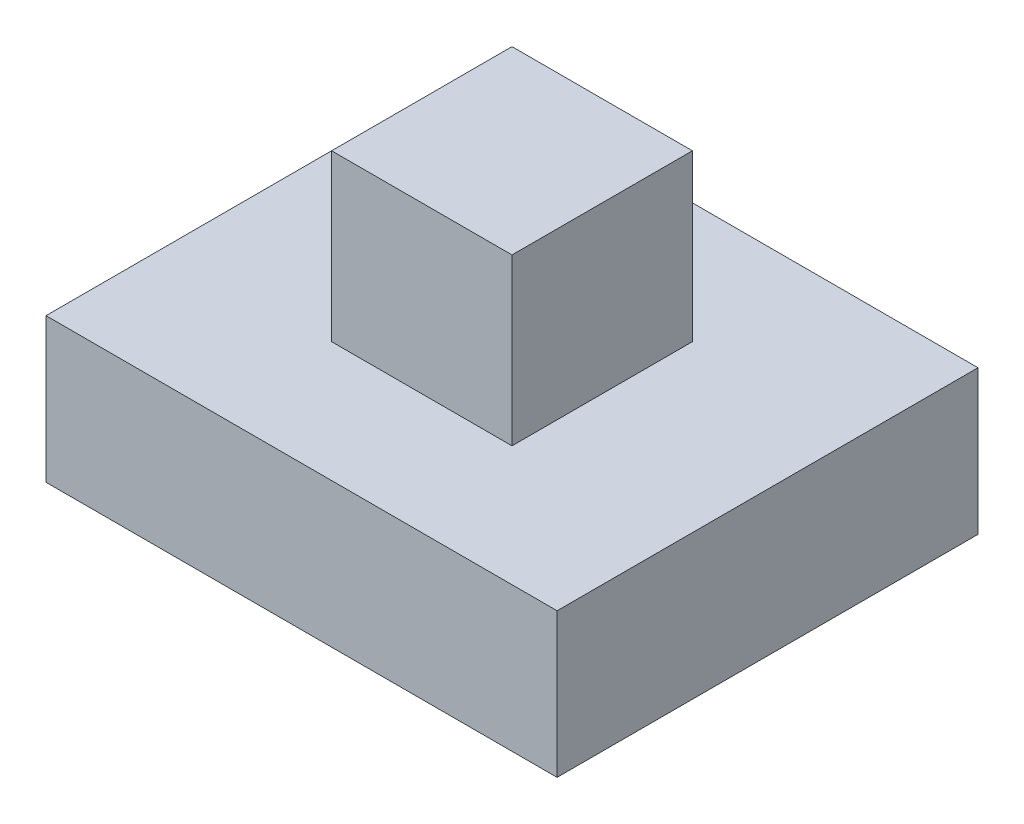
ISO-10303-21;
HEADER;
FILE_DESCRIPTION(('STEP AP214'),'2;1');
FILE_NAME('part.step','',(''),(''),'','','');
FILE_SCHEMA(('AUTOMOTIVE_DESIGN { 1 0 10303 214 1 1 1 1 }'));
ENDSEC;
DATA;
#1=APPLICATION_CONTEXT('core data for automotive mechanical design processes');
#2=APPLICATION_PROTOCOL_DEFINITION('international standard','automotive_design',2000,#1);
#3=PRODUCT_CONTEXT('',#1,'mechanical');
#4=PRODUCT('Part','Part','',(#3));
#5=PRODUCT_RELATED_PRODUCT_CATEGORY('part','',(#4));
#6=PRODUCT_DEFINITION_FORMATION('','',#4);
#7=PRODUCT_DEFINITION_CONTEXT('part definition',#1,'design');
#8=PRODUCT_DEFINITION('design','',#6,#7);
#9=PRODUCT_DEFINITION_SHAPE('','',#8);
#10=(LENGTH_UNIT() NAMED_UNIT(*) SI_UNIT(.MILLI.,.METRE.));
#11=(NAMED_UNIT(*) PLANE_ANGLE_UNIT() SI_UNIT($,.RADIAN.));
#12=(NAMED_UNIT(*) SI_UNIT($,.STERADIAN.) SOLID_ANGLE_UNIT());
#13=UNCERTAINTY_MEASURE_WITH_UNIT(LENGTH_MEASURE(1.E-05),#10,'distance_accuracy_value','');
#14=(GEOMETRIC_REPRESENTATION_CONTEXT(3) GLOBAL_UNCERTAINTY_ASSIGNED_CONTEXT((#13)) GLOBAL_UNIT_ASSIGNED_CONTEXT((#10,
#11,#12)) REPRESENTATION_CONTEXT('',''));
#15=CARTESIAN_POINT('',(0.,0.,0.));
#16=DIRECTION('',(0.,0.,1.));
#17=DIRECTION('',(1.,0.,0.));
#18=AXIS2_PLACEMENT_3D('',#15,#16,#17);
#19=CARTESIAN_POINT('',(0.,0.,0.));
#20=DIRECTION('',(0.,1.,0.));
#21=DIRECTION('',(0.,0.,1.));
#22=AXIS2_PLACEMENT_3D('',#19,#20,#21);
#23=PLANE('',#22);
#24=DIRECTION('',(0.,0.,1.));
#25=VECTOR('',#24,1.);
#26=CARTESIAN_POINT('',(8.5,0.,0.));
#27=LINE('',#26,#25);
#28=CARTESIAN_POINT('',(8.5,0.,-7.));
#29=VERTEX_POINT('',#28);
#30=CARTESIAN_POINT('',(8.5,0.,7.));
#31=VERTEX_POINT('',#30);
#32=EDGE_CURVE('E190',#29,#31,#27,.T.);
#33=ORIENTED_EDGE('',*,*,#32,.F.);
#34=DIRECTION('',(1.,0.,0.));
#35=VECTOR('',#34,1.);
#36=CARTESIAN_POINT('',(0.,0.,-7.));
#37=LINE('',#36,#35);
#38=CARTESIAN_POINT('',(-8.5,0.,-7.));
#39=VERTEX_POINT('',#38);
#40=EDGE_CURVE('E204',#39,#29,#37,.T.);
#41=ORIENTED_EDGE('',*,*,#40,.F.);
#42=DIRECTION('',(0.,0.,1.));
#43=VECTOR('',#42,1.);
#44=CARTESIAN_POINT('',(-8.5,0.,0.));
#45=LINE('',#44,#43);
#46=CARTESIAN_POINT('',(-8.5,0.,7.));
#47=VERTEX_POINT('',#46);
#48=EDGE_CURVE('E206',#39,#47,#45,.T.);
#49=ORIENTED_EDGE('',*,*,#48,.T.);
#50=DIRECTION('',(1.,0.,0.));
#51=VECTOR('',#50,1.);
#52=CARTESIAN_POINT('',(0.,0.,7.));
#53=LINE('',#52,#51);
#54=EDGE_CURVE('E194',#47,#31,#53,.T.);
#55=ORIENTED_EDGE('',*,*,#54,.T.);
#56=EDGE_LOOP('',(#33,#41,#49,#55));
#57=FACE_BOUND('',#56,.T.);
#58=DIRECTION('',(1.,0.,0.));
#59=VECTOR('',#58,1.);
#60=CARTESIAN_POINT('',(0.,0.,-3.));
#61=LINE('',#60,#59);
#62=CARTESIAN_POINT('',(-3.,0.,-3.));
#63=VERTEX_POINT('',#62);
#64=CARTESIAN_POINT('',(3.,0.,-3.));
#65=VERTEX_POINT('',#64);
#66=EDGE_CURVE('E151',#63,#65,#61,.T.);
#67=ORIENTED_EDGE('',*,*,#66,.T.);
#68=DIRECTION('',(0.,0.,1.));
#69=VECTOR('',#68,1.);
#70=CARTESIAN_POINT('',(3.,0.,0.));
#71=LINE('',#70,#69);
#72=CARTESIAN_POINT('',(3.,0.,3.));
#73=VERTEX_POINT('',#72);
#74=EDGE_CURVE('E51',#65,#73,#71,.T.);
#75=ORIENTED_EDGE('',*,*,#74,.T.);
#76=DIRECTION('',(1.,0.,0.));
#77=VECTOR('',#76,1.);
#78=CARTESIAN_POINT('',(0.,0.,3.));
#79=LINE('',#78,#77);
#80=CARTESIAN_POINT('',(-3.,0.,3.));
#81=VERTEX_POINT('',#80);
#82=EDGE_CURVE('E140',#81,#73,#79,.T.);
#83=ORIENTED_EDGE('',*,*,#82,.F.);
#84=DIRECTION('',(0.,0.,1.));
#85=VECTOR('',#84,1.);
#86=CARTESIAN_POINT('',(-3.,0.,0.));
#87=LINE('',#86,#85);
#88=EDGE_CURVE('E153',#63,#81,#87,.T.);
#89=ORIENTED_EDGE('',*,*,#88,.F.);
#90=EDGE_LOOP('',(#67,#75,#83,#89));
#91=FACE_BOUND('',#90,.T.);
#92=ADVANCED_FACE('F34',(#57,#91),#23,.T.);
#93=CARTESIAN_POINT('',(8.5,-4.8,0.));
#94=DIRECTION('',(-1.,0.,0.));
#95=DIRECTION('',(0.,0.,1.));
#96=AXIS2_PLACEMENT_3D('',#93,#94,#95);
#97=PLANE('',#96);
#98=ORIENTED_EDGE('',*,*,#32,.T.);
#99=DIRECTION('',(0.,1.,0.));
#100=VECTOR('',#99,1.);
#101=CARTESIAN_POINT('',(8.5,-4.8,7.));
#102=LINE('',#101,#100);
#103=CARTESIAN_POINT('',(8.5,-4.8,7.));
#104=VERTEX_POINT('',#103);
#105=EDGE_CURVE('E11',#104,#31,#102,.T.);
#106=ORIENTED_EDGE('',*,*,#105,.F.);
#107=DIRECTION('',(0.,0.,1.));
#108=VECTOR('',#107,1.);
#109=CARTESIAN_POINT('',(8.5,-4.8,0.));
#110=LINE('',#109,#108);
#111=CARTESIAN_POINT('',(8.5,-4.8,-7.));
#112=VERTEX_POINT('',#111);
#113=EDGE_CURVE('E191',#112,#104,#110,.T.);
#114=ORIENTED_EDGE('',*,*,#113,.F.);
#115=DIRECTION('',(0.,1.,0.));
#116=VECTOR('',#115,1.);
#117=CARTESIAN_POINT('',(8.5,-4.8,-7.));
#118=LINE('',#117,#116);
#119=EDGE_CURVE('E38',#112,#29,#118,.T.);
#120=ORIENTED_EDGE('',*,*,#119,.T.);
#121=EDGE_LOOP('',(#98,#106,#114,#120));
#122=FACE_BOUND('',#121,.T.);
#123=ADVANCED_FACE('F36',(#122),#97,.F.);
#124=CARTESIAN_POINT('',(0.,-4.8,7.));
#125=DIRECTION('',(0.,0.,1.));
#126=DIRECTION('',(1.,0.,0.));
#127=AXIS2_PLACEMENT_3D('',#124,#125,#126);
#128=PLANE('',#127);
#129=ORIENTED_EDGE('',*,*,#54,.F.);
#130=DIRECTION('',(0.,1.,0.));
#131=VECTOR('',#130,1.);
#132=CARTESIAN_POINT('',(-8.5,-4.8,7.));
#133=LINE('',#132,#131);
#134=CARTESIAN_POINT('',(-8.5,-4.8,7.));
#135=VERTEX_POINT('',#134);
#136=EDGE_CURVE('E43',#135,#47,#133,.T.);
#137=ORIENTED_EDGE('',*,*,#136,.F.);
#138=DIRECTION('',(1.,0.,0.));
#139=VECTOR('',#138,1.);
#140=CARTESIAN_POINT('',(0.,-4.8,7.));
#141=LINE('',#140,#139);
#142=EDGE_CURVE('E199',#135,#104,#141,.T.);
#143=ORIENTED_EDGE('',*,*,#142,.T.);
#144=ORIENTED_EDGE('',*,*,#105,.T.);
#145=EDGE_LOOP('',(#129,#137,#143,#144));
#146=FACE_BOUND('',#145,.T.);
#147=ADVANCED_FACE('F226',(#146),#128,.T.);
#148=CARTESIAN_POINT('',(-8.5,-4.8,0.));
#149=DIRECTION('',(-1.,0.,0.));
#150=DIRECTION('',(0.,0.,1.));
#151=AXIS2_PLACEMENT_3D('',#148,#149,#150);
#152=PLANE('',#151);
#153=ORIENTED_EDGE('',*,*,#48,.F.);
#154=DIRECTION('',(0.,1.,0.));
#155=VECTOR('',#154,1.);
#156=CARTESIAN_POINT('',(-8.5,-4.8,-7.));
#157=LINE('',#156,#155);
#158=CARTESIAN_POINT('',(-8.5,-4.8,-7.));
#159=VERTEX_POINT('',#158);
#160=EDGE_CURVE('E211',#159,#39,#157,.T.);
#161=ORIENTED_EDGE('',*,*,#160,.F.);
#162=DIRECTION('',(0.,0.,1.));
#163=VECTOR('',#162,1.);
#164=CARTESIAN_POINT('',(-8.5,-4.8,0.));
#165=LINE('',#164,#163);
#166=EDGE_CURVE('E196',#159,#135,#165,.T.);
#167=ORIENTED_EDGE('',*,*,#166,.T.);
#168=ORIENTED_EDGE('',*,*,#136,.T.);
#169=EDGE_LOOP('',(#153,#161,#167,#168));
#170=FACE_BOUND('',#169,.T.);
#171=ADVANCED_FACE('F233',(#170),#152,.T.);
#172=CARTESIAN_POINT('',(0.,-4.8,-7.));
#173=DIRECTION('',(0.,0.,1.));
#174=DIRECTION('',(1.,0.,0.));
#175=AXIS2_PLACEMENT_3D('',#172,#173,#174);
#176=PLANE('',#175);
#177=ORIENTED_EDGE('',*,*,#40,.T.);
#178=ORIENTED_EDGE('',*,*,#119,.F.);
#179=DIRECTION('',(1.,0.,0.));
#180=VECTOR('',#179,1.);
#181=CARTESIAN_POINT('',(0.,-4.8,-7.));
#182=LINE('',#181,#180);
#183=EDGE_CURVE('E193',#159,#112,#182,.T.);
#184=ORIENTED_EDGE('',*,*,#183,.F.);
#185=ORIENTED_EDGE('',*,*,#160,.T.);
#186=EDGE_LOOP('',(#177,#178,#184,#185));
#187=FACE_BOUND('',#186,.T.);
#188=ADVANCED_FACE('F231',(#187),#176,.F.);
#189=CARTESIAN_POINT('',(0.,-4.8,0.));
#190=DIRECTION('',(0.,1.,0.));
#191=DIRECTION('',(0.,0.,1.));
#192=AXIS2_PLACEMENT_3D('',#189,#190,#191);
#193=PLANE('',#192);
#194=DIRECTION('',(1.,0.,0.));
#195=VECTOR('',#194,1.);
#196=CARTESIAN_POINT('',(0.,-4.8,4.5));
#197=LINE('',#196,#195);
#198=CARTESIAN_POINT('',(-4.5,-4.8,4.5));
#199=VERTEX_POINT('',#198);
#200=CARTESIAN_POINT('',(4.5,-4.8,4.5));
#201=VERTEX_POINT('',#200);
#202=EDGE_CURVE('E166',#199,#201,#197,.T.);
#203=ORIENTED_EDGE('',*,*,#202,.T.);
#204=DIRECTION('',(0.,0.,1.));
#205=VECTOR('',#204,1.);
#206=CARTESIAN_POINT('',(4.5,-4.8,0.));
#207=LINE('',#206,#205);
#208=CARTESIAN_POINT('',(4.5,-4.8,-4.5));
#209=VERTEX_POINT('',#208);
#210=EDGE_CURVE('E59',#209,#201,#207,.T.);
#211=ORIENTED_EDGE('',*,*,#210,.F.);
#212=DIRECTION('',(1.,0.,0.));
#213=VECTOR('',#212,1.);
#214=CARTESIAN_POINT('',(0.,-4.8,-4.5));
#215=LINE('',#214,#213);
#216=CARTESIAN_POINT('',(-4.5,-4.8,-4.5));
#217=VERTEX_POINT('',#216);
#218=EDGE_CURVE('E175',#217,#209,#215,.T.);
#219=ORIENTED_EDGE('',*,*,#218,.F.);
#220=DIRECTION('',(0.,0.,1.));
#221=VECTOR('',#220,1.);
#222=CARTESIAN_POINT('',(-4.5,-4.8,0.));
#223=LINE('',#222,#221);
#224=EDGE_CURVE('E178',#217,#199,#223,.T.);
#225=ORIENTED_EDGE('',*,*,#224,.T.);
#226=EDGE_LOOP('',(#203,#211,#219,#225));
#227=FACE_BOUND('',#226,.T.);
#228=ORIENTED_EDGE('',*,*,#113,.T.);
#229=ORIENTED_EDGE('',*,*,#142,.F.);
#230=ORIENTED_EDGE('',*,*,#166,.F.);
#231=ORIENTED_EDGE('',*,*,#183,.T.);
#232=EDGE_LOOP('',(#228,#229,#230,#231));
#233=FACE_BOUND('',#232,.T.);
#234=ADVANCED_FACE('F230',(#227,#233),#193,.F.);
#235=CARTESIAN_POINT('',(4.5,-1.8,0.));
#236=DIRECTION('',(1.,0.,0.));
#237=DIRECTION('',(0.,0.,-1.));
#238=AXIS2_PLACEMENT_3D('',#235,#236,#237);
#239=PLANE('',#238);
#240=ORIENTED_EDGE('',*,*,#210,.T.);
#241=DIRECTION('',(0.,-1.,0.));
#242=VECTOR('',#241,1.);
#243=CARTESIAN_POINT('',(4.5,-1.8,4.5));
#244=LINE('',#243,#242);
#245=CARTESIAN_POINT('',(4.5,-1.8,4.5));
#246=VERTEX_POINT('',#245);
#247=EDGE_CURVE('E173',#246,#201,#244,.T.);
#248=ORIENTED_EDGE('',*,*,#247,.F.);
#249=DIRECTION('',(0.,0.,1.));
#250=VECTOR('',#249,1.);
#251=CARTESIAN_POINT('',(4.5,-1.8,0.));
#252=LINE('',#251,#250);
#253=CARTESIAN_POINT('',(4.5,-1.8,-4.5));
#254=VERTEX_POINT('',#253);
#255=EDGE_CURVE('E162',#254,#246,#252,.T.);
#256=ORIENTED_EDGE('',*,*,#255,.F.);
#257=DIRECTION('',(0.,-1.,0.));
#258=VECTOR('',#257,1.);
#259=CARTESIAN_POINT('',(4.5,-1.8,-4.5));
#260=LINE('',#259,#258);
#261=EDGE_CURVE('E188',#254,#209,#260,.T.);
#262=ORIENTED_EDGE('',*,*,#261,.T.);
#263=EDGE_LOOP('',(#240,#248,#256,#262));
#264=FACE_BOUND('',#263,.T.);
#265=ADVANCED_FACE('F238',(#264),#239,.F.);
#266=CARTESIAN_POINT('',(0.,-1.8,-4.5));
#267=DIRECTION('',(0.,0.,-1.));
#268=DIRECTION('',(-1.,0.,0.));
#269=AXIS2_PLACEMENT_3D('',#266,#267,#268);
#270=PLANE('',#269);
#271=ORIENTED_EDGE('',*,*,#218,.T.);
#272=ORIENTED_EDGE('',*,*,#261,.F.);
#273=DIRECTION('',(1.,0.,0.));
#274=VECTOR('',#273,1.);
#275=CARTESIAN_POINT('',(0.,-1.8,-4.5));
#276=LINE('',#275,#274);
#277=CARTESIAN_POINT('',(-4.5,-1.8,-4.5));
#278=VERTEX_POINT('',#277);
#279=EDGE_CURVE('E165',#278,#254,#276,.T.);
#280=ORIENTED_EDGE('',*,*,#279,.F.);
#281=DIRECTION('',(0.,-1.,0.));
#282=VECTOR('',#281,1.);
#283=CARTESIAN_POINT('',(-4.5,-1.8,-4.5));
#284=LINE('',#283,#282);
#285=EDGE_CURVE('E186',#278,#217,#284,.T.);
#286=ORIENTED_EDGE('',*,*,#285,.T.);
#287=EDGE_LOOP('',(#271,#272,#280,#286));
#288=FACE_BOUND('',#287,.T.);
#289=ADVANCED_FACE('F278',(#288),#270,.F.);
#290=CARTESIAN_POINT('',(-4.5,-1.8,0.));
#291=DIRECTION('',(1.,0.,0.));
#292=DIRECTION('',(0.,0.,-1.));
#293=AXIS2_PLACEMENT_3D('',#290,#291,#292);
#294=PLANE('',#293);
#295=ORIENTED_EDGE('',*,*,#224,.F.);
#296=ORIENTED_EDGE('',*,*,#285,.F.);
#297=DIRECTION('',(0.,0.,1.));
#298=VECTOR('',#297,1.);
#299=CARTESIAN_POINT('',(-4.5,-1.8,0.));
#300=LINE('',#299,#298);
#301=CARTESIAN_POINT('',(-4.5,-1.8,4.5));
#302=VERTEX_POINT('',#301);
#303=EDGE_CURVE('E169',#278,#302,#300,.T.);
#304=ORIENTED_EDGE('',*,*,#303,.T.);
#305=DIRECTION('',(0.,-1.,0.));
#306=VECTOR('',#305,1.);
#307=CARTESIAN_POINT('',(-4.5,-1.8,4.5));
#308=LINE('',#307,#306);
#309=EDGE_CURVE('E184',#302,#199,#308,.T.);
#310=ORIENTED_EDGE('',*,*,#309,.T.);
#311=EDGE_LOOP('',(#295,#296,#304,#310));
#312=FACE_BOUND('',#311,.T.);
#313=ADVANCED_FACE('F286',(#312),#294,.T.);
#314=CARTESIAN_POINT('',(0.,-1.8,4.5));
#315=DIRECTION('',(0.,0.,-1.));
#316=DIRECTION('',(-1.,0.,0.));
#317=AXIS2_PLACEMENT_3D('',#314,#315,#316);
#318=PLANE('',#317);
#319=ORIENTED_EDGE('',*,*,#202,.F.);
#320=ORIENTED_EDGE('',*,*,#309,.F.);
#321=DIRECTION('',(1.,0.,0.));
#322=VECTOR('',#321,1.);
#323=CARTESIAN_POINT('',(0.,-1.8,4.5));
#324=LINE('',#323,#322);
#325=EDGE_CURVE('E171',#302,#246,#324,.T.);
#326=ORIENTED_EDGE('',*,*,#325,.T.);
#327=ORIENTED_EDGE('',*,*,#247,.T.);
#328=EDGE_LOOP('',(#319,#320,#326,#327));
#329=FACE_BOUND('',#328,.T.);
#330=ADVANCED_FACE('F296',(#329),#318,.T.);
#331=CARTESIAN_POINT('',(0.,-1.8,0.));
#332=DIRECTION('',(0.,1.,0.));
#333=DIRECTION('',(0.,0.,1.));
#334=AXIS2_PLACEMENT_3D('',#331,#332,#333);
#335=PLANE('',#334);
#336=ORIENTED_EDGE('',*,*,#255,.T.);
#337=ORIENTED_EDGE('',*,*,#325,.F.);
#338=ORIENTED_EDGE('',*,*,#303,.F.);
#339=ORIENTED_EDGE('',*,*,#279,.T.);
#340=EDGE_LOOP('',(#336,#337,#338,#339));
#341=FACE_BOUND('',#340,.T.);
#342=ADVANCED_FACE('F306',(#341),#335,.F.);
#343=CARTESIAN_POINT('',(3.,5.5,0.));
#344=DIRECTION('',(1.,0.,0.));
#345=DIRECTION('',(0.,0.,-1.));
#346=AXIS2_PLACEMENT_3D('',#343,#344,#345);
#347=PLANE('',#346);
#348=ORIENTED_EDGE('',*,*,#74,.F.);
#349=DIRECTION('',(0.,-1.,0.));
#350=VECTOR('',#349,1.);
#351=CARTESIAN_POINT('',(3.,5.5,-3.));
#352=LINE('',#351,#350);
#353=CARTESIAN_POINT('',(3.,5.5,-3.));
#354=VERTEX_POINT('',#353);
#355=EDGE_CURVE('E123',#354,#65,#352,.T.);
#356=ORIENTED_EDGE('',*,*,#355,.F.);
#357=DIRECTION('',(0.,0.,1.));
#358=VECTOR('',#357,1.);
#359=CARTESIAN_POINT('',(3.,5.5,0.));
#360=LINE('',#359,#358);
#361=CARTESIAN_POINT('',(3.,5.5,3.));
#362=VERTEX_POINT('',#361);
#363=EDGE_CURVE('E126',#354,#362,#360,.T.);
#364=ORIENTED_EDGE('',*,*,#363,.T.);
#365=DIRECTION('',(0.,-1.,0.));
#366=VECTOR('',#365,1.);
#367=CARTESIAN_POINT('',(3.,5.5,3.));
#368=LINE('',#367,#366);
#369=EDGE_CURVE('E149',#362,#73,#368,.T.);
#370=ORIENTED_EDGE('',*,*,#369,.T.);
#371=EDGE_LOOP('',(#348,#356,#364,#370));
#372=FACE_BOUND('',#371,.T.);
#373=ADVANCED_FACE('F125',(#372),#347,.T.);
#374=CARTESIAN_POINT('',(0.,5.5,-3.));
#375=DIRECTION('',(0.,0.,-1.));
#376=DIRECTION('',(-1.,0.,0.));
#377=AXIS2_PLACEMENT_3D('',#374,#375,#376);
#378=PLANE('',#377);
#379=ORIENTED_EDGE('',*,*,#66,.F.);
#380=DIRECTION('',(0.,-1.,0.));
#381=VECTOR('',#380,1.);
#382=CARTESIAN_POINT('',(-3.,5.5,-3.));
#383=LINE('',#382,#381);
#384=CARTESIAN_POINT('',(-3.,5.5,-3.));
#385=VERTEX_POINT('',#384);
#386=EDGE_CURVE('E131',#385,#63,#383,.T.);
#387=ORIENTED_EDGE('',*,*,#386,.F.);
#388=DIRECTION('',(1.,0.,0.));
#389=VECTOR('',#388,1.);
#390=CARTESIAN_POINT('',(0.,5.5,-3.));
#391=LINE('',#390,#389);
#392=EDGE_CURVE('E136',#385,#354,#391,.T.);
#393=ORIENTED_EDGE('',*,*,#392,.T.);
#394=ORIENTED_EDGE('',*,*,#355,.T.);
#395=EDGE_LOOP('',(#379,#387,#393,#394));
#396=FACE_BOUND('',#395,.T.);
#397=ADVANCED_FACE('F142',(#396),#378,.T.);
#398=CARTESIAN_POINT('',(-3.,5.5,0.));
#399=DIRECTION('',(1.,0.,0.));
#400=DIRECTION('',(0.,0.,-1.));
#401=AXIS2_PLACEMENT_3D('',#398,#399,#400);
#402=PLANE('',#401);
#403=ORIENTED_EDGE('',*,*,#88,.T.);
#404=DIRECTION('',(0.,-1.,0.));
#405=VECTOR('',#404,1.);
#406=CARTESIAN_POINT('',(-3.,5.5,3.));
#407=LINE('',#406,#405);
#408=CARTESIAN_POINT('',(-3.,5.5,3.));
#409=VERTEX_POINT('',#408);
#410=EDGE_CURVE('E158',#409,#81,#407,.T.);
#411=ORIENTED_EDGE('',*,*,#410,.F.);
#412=DIRECTION('',(0.,0.,1.));
#413=VECTOR('',#412,1.);
#414=CARTESIAN_POINT('',(-3.,5.5,0.));
#415=LINE('',#414,#413);
#416=EDGE_CURVE('E144',#385,#409,#415,.T.);
#417=ORIENTED_EDGE('',*,*,#416,.F.);
#418=ORIENTED_EDGE('',*,*,#386,.T.);
#419=EDGE_LOOP('',(#403,#411,#417,#418));
#420=FACE_BOUND('',#419,.T.);
#421=ADVANCED_FACE('F337',(#420),#402,.F.);
#422=CARTESIAN_POINT('',(0.,5.5,3.));
#423=DIRECTION('',(0.,0.,-1.));
#424=DIRECTION('',(-1.,0.,0.));
#425=AXIS2_PLACEMENT_3D('',#422,#423,#424);
#426=PLANE('',#425);
#427=ORIENTED_EDGE('',*,*,#82,.T.);
#428=ORIENTED_EDGE('',*,*,#369,.F.);
#429=DIRECTION('',(1.,0.,0.));
#430=VECTOR('',#429,1.);
#431=CARTESIAN_POINT('',(0.,5.5,3.));
#432=LINE('',#431,#430);
#433=EDGE_CURVE('E138',#409,#362,#432,.T.);
#434=ORIENTED_EDGE('',*,*,#433,.F.);
#435=ORIENTED_EDGE('',*,*,#410,.T.);
#436=EDGE_LOOP('',(#427,#428,#434,#435));
#437=FACE_BOUND('',#436,.T.);
#438=ADVANCED_FACE('F346',(#437),#426,.F.);
#439=CARTESIAN_POINT('',(0.,5.5,0.));
#440=DIRECTION('',(0.,1.,0.));
#441=DIRECTION('',(0.,0.,1.));
#442=AXIS2_PLACEMENT_3D('',#439,#440,#441);
#443=PLANE('',#442);
#444=ORIENTED_EDGE('',*,*,#363,.F.);
#445=ORIENTED_EDGE('',*,*,#392,.F.);
#446=ORIENTED_EDGE('',*,*,#416,.T.);
#447=ORIENTED_EDGE('',*,*,#433,.T.);
#448=EDGE_LOOP('',(#444,#445,#446,#447));
#449=FACE_BOUND('',#448,.T.);
#450=ADVANCED_FACE('F135',(#449),#443,.T.);
#451=CLOSED_SHELL('',(#92,#123,#147,#171,#188,#234,#265,#289,#313,#330,#342,#373,#397,#421,#438,#450));
#452=MANIFOLD_SOLID_BREP('B2',#451);
#453=ADVANCED_BREP_SHAPE_REPRESENTATION('',(#18,#452),#14);
#454=SHAPE_DEFINITION_REPRESENTATION(#9,#453);
ENDSEC;
END-ISO-10303-21;
